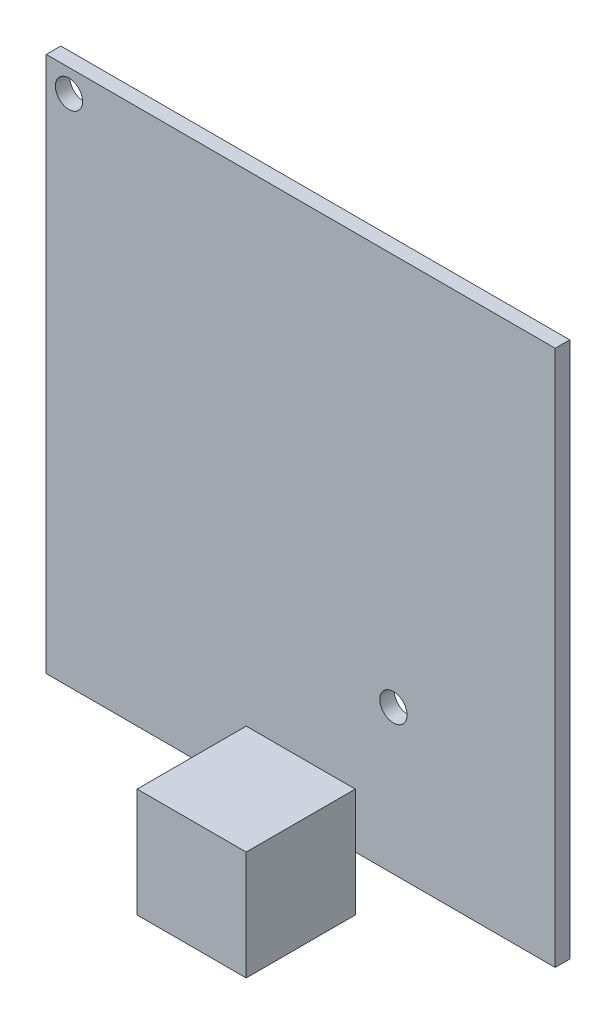
ISO-10303-21;
HEADER;
FILE_DESCRIPTION(('STEP AP214'),'2;1');
FILE_NAME('part.step','',(''),(''),'','','');
FILE_SCHEMA(('AUTOMOTIVE_DESIGN { 1 0 10303 214 1 1 1 1 }'));
ENDSEC;
DATA;
#1=APPLICATION_CONTEXT('core data for automotive mechanical design processes');
#2=APPLICATION_PROTOCOL_DEFINITION('international standard','automotive_design',2000,#1);
#3=PRODUCT_CONTEXT('',#1,'mechanical');
#4=PRODUCT('Part','Part','',(#3));
#5=PRODUCT_RELATED_PRODUCT_CATEGORY('part','',(#4));
#6=PRODUCT_DEFINITION_FORMATION('','',#4);
#7=PRODUCT_DEFINITION_CONTEXT('part definition',#1,'design');
#8=PRODUCT_DEFINITION('design','',#6,#7);
#9=PRODUCT_DEFINITION_SHAPE('','',#8);
#10=(LENGTH_UNIT() NAMED_UNIT(*) SI_UNIT(.MILLI.,.METRE.));
#11=(NAMED_UNIT(*) PLANE_ANGLE_UNIT() SI_UNIT($,.RADIAN.));
#12=(NAMED_UNIT(*) SI_UNIT($,.STERADIAN.) SOLID_ANGLE_UNIT());
#13=UNCERTAINTY_MEASURE_WITH_UNIT(LENGTH_MEASURE(1.E-05),#10,'distance_accuracy_value','');
#14=(GEOMETRIC_REPRESENTATION_CONTEXT(3) GLOBAL_UNCERTAINTY_ASSIGNED_CONTEXT((#13)) GLOBAL_UNIT_ASSIGNED_CONTEXT((#10,
#11,#12)) REPRESENTATION_CONTEXT('',''));
#15=CARTESIAN_POINT('',(0.,0.,0.));
#16=DIRECTION('',(0.,0.,1.));
#17=DIRECTION('',(1.,0.,0.));
#18=AXIS2_PLACEMENT_3D('',#15,#16,#17);
#19=CARTESIAN_POINT('',(28.,0.,13.6));
#20=DIRECTION('',(0.,0.,1.));
#21=DIRECTION('',(1.,0.,0.));
#22=AXIS2_PLACEMENT_3D('',#19,#20,#21);
#23=PLANE('',#22);
#24=DIRECTION('',(0.,1.,0.));
#25=VECTOR('',#24,1.);
#26=CARTESIAN_POINT('',(22.,-6.,13.6));
#27=LINE('',#26,#25);
#28=CARTESIAN_POINT('',(22.,-6.,13.6));
#29=VERTEX_POINT('',#28);
#30=CARTESIAN_POINT('',(22.,6.,13.6));
#31=VERTEX_POINT('',#30);
#32=EDGE_CURVE('E107',#29,#31,#27,.T.);
#33=ORIENTED_EDGE('',*,*,#32,.F.);
#34=DIRECTION('',(1.,0.,0.));
#35=VECTOR('',#34,1.);
#36=CARTESIAN_POINT('',(34.,-6.,13.6));
#37=LINE('',#36,#35);
#38=CARTESIAN_POINT('',(34.,-6.,13.6));
#39=VERTEX_POINT('',#38);
#40=EDGE_CURVE('E90',#39,#29,#37,.F.);
#41=ORIENTED_EDGE('',*,*,#40,.F.);
#42=DIRECTION('',(0.,1.,0.));
#43=VECTOR('',#42,1.);
#44=CARTESIAN_POINT('',(34.,6.,13.6));
#45=LINE('',#44,#43);
#46=CARTESIAN_POINT('',(34.,6.,13.6));
#47=VERTEX_POINT('',#46);
#48=EDGE_CURVE('E96',#47,#39,#45,.F.);
#49=ORIENTED_EDGE('',*,*,#48,.F.);
#50=DIRECTION('',(1.,0.,0.));
#51=VECTOR('',#50,1.);
#52=CARTESIAN_POINT('',(22.,6.,13.6));
#53=LINE('',#52,#51);
#54=EDGE_CURVE('E187',#31,#47,#53,.T.);
#55=ORIENTED_EDGE('',*,*,#54,.F.);
#56=EDGE_LOOP('',(#33,#41,#49,#55));
#57=FACE_BOUND('',#56,.T.);
#58=ADVANCED_FACE('F17',(#57),#23,.T.);
#59=CARTESIAN_POINT('',(34.,-6.,1.6));
#60=DIRECTION('',(0.,-1.,0.));
#61=DIRECTION('',(0.,0.,-1.));
#62=AXIS2_PLACEMENT_3D('',#59,#60,#61);
#63=PLANE('',#62);
#64=DIRECTION('',(1.,0.,0.));
#65=VECTOR('',#64,1.);
#66=CARTESIAN_POINT('',(28.,-6.,1.6));
#67=LINE('',#66,#65);
#68=CARTESIAN_POINT('',(22.,-6.,1.6));
#69=VERTEX_POINT('',#68);
#70=CARTESIAN_POINT('',(34.,-6.,1.6));
#71=VERTEX_POINT('',#70);
#72=EDGE_CURVE('E112',#69,#71,#67,.T.);
#73=ORIENTED_EDGE('',*,*,#72,.T.);
#74=DIRECTION('',(0.,0.,-1.));
#75=VECTOR('',#74,1.);
#76=CARTESIAN_POINT('',(34.,-6.,1.6));
#77=LINE('',#76,#75);
#78=EDGE_CURVE('E100',#39,#71,#77,.T.);
#79=ORIENTED_EDGE('',*,*,#78,.F.);
#80=ORIENTED_EDGE('',*,*,#40,.T.);
#81=DIRECTION('',(0.,0.,1.));
#82=VECTOR('',#81,1.);
#83=CARTESIAN_POINT('',(22.,-6.,1.6));
#84=LINE('',#83,#82);
#85=EDGE_CURVE('E114',#69,#29,#84,.T.);
#86=ORIENTED_EDGE('',*,*,#85,.F.);
#87=EDGE_LOOP('',(#73,#79,#80,#86));
#88=FACE_BOUND('',#87,.T.);
#89=ADVANCED_FACE('F110',(#88),#63,.T.);
#90=CARTESIAN_POINT('',(34.,6.,1.6));
#91=DIRECTION('',(1.,0.,0.));
#92=DIRECTION('',(0.,0.,-1.));
#93=AXIS2_PLACEMENT_3D('',#90,#91,#92);
#94=PLANE('',#93);
#95=DIRECTION('',(0.,1.,0.));
#96=VECTOR('',#95,1.);
#97=CARTESIAN_POINT('',(34.,29.5,1.6));
#98=LINE('',#97,#96);
#99=CARTESIAN_POINT('',(34.,6.,1.6));
#100=VERTEX_POINT('',#99);
#101=CARTESIAN_POINT('',(34.,0.,1.6));
#102=VERTEX_POINT('',#101);
#103=EDGE_CURVE('E175',#100,#102,#98,.F.);
#104=ORIENTED_EDGE('',*,*,#103,.F.);
#105=DIRECTION('',(0.,0.,1.));
#106=VECTOR('',#105,1.);
#107=CARTESIAN_POINT('',(34.,6.,1.6));
#108=LINE('',#107,#106);
#109=EDGE_CURVE('E102',#47,#100,#108,.F.);
#110=ORIENTED_EDGE('',*,*,#109,.F.);
#111=ORIENTED_EDGE('',*,*,#48,.T.);
#112=ORIENTED_EDGE('',*,*,#78,.T.);
#113=DIRECTION('',(0.,1.,0.));
#114=VECTOR('',#113,1.);
#115=CARTESIAN_POINT('',(34.,0.,1.6));
#116=LINE('',#115,#114);
#117=EDGE_CURVE('E177',#71,#102,#116,.T.);
#118=ORIENTED_EDGE('',*,*,#117,.T.);
#119=EDGE_LOOP('',(#104,#110,#111,#112,#118));
#120=FACE_BOUND('',#119,.T.);
#121=ADVANCED_FACE('F98',(#120),#94,.T.);
#122=CARTESIAN_POINT('',(22.,-6.,1.6));
#123=DIRECTION('',(-1.,0.,0.));
#124=DIRECTION('',(0.,0.,1.));
#125=AXIS2_PLACEMENT_3D('',#122,#123,#124);
#126=PLANE('',#125);
#127=DIRECTION('',(0.,1.,0.));
#128=VECTOR('',#127,1.);
#129=CARTESIAN_POINT('',(22.,0.,1.6));
#130=LINE('',#129,#128);
#131=CARTESIAN_POINT('',(22.,0.,1.6));
#132=VERTEX_POINT('',#131);
#133=EDGE_CURVE('E180',#132,#69,#130,.F.);
#134=ORIENTED_EDGE('',*,*,#133,.T.);
#135=ORIENTED_EDGE('',*,*,#85,.T.);
#136=ORIENTED_EDGE('',*,*,#32,.T.);
#137=DIRECTION('',(0.,0.,1.));
#138=VECTOR('',#137,1.);
#139=CARTESIAN_POINT('',(22.,6.,1.6));
#140=LINE('',#139,#138);
#141=CARTESIAN_POINT('',(22.,6.,1.6));
#142=VERTEX_POINT('',#141);
#143=EDGE_CURVE('E183',#142,#31,#140,.T.);
#144=ORIENTED_EDGE('',*,*,#143,.F.);
#145=DIRECTION('',(0.,1.,0.));
#146=VECTOR('',#145,1.);
#147=CARTESIAN_POINT('',(22.,29.5,1.6));
#148=LINE('',#147,#146);
#149=EDGE_CURVE('E173',#132,#142,#148,.T.);
#150=ORIENTED_EDGE('',*,*,#149,.F.);
#151=EDGE_LOOP('',(#134,#135,#136,#144,#150));
#152=FACE_BOUND('',#151,.T.);
#153=ADVANCED_FACE('F189',(#152),#126,.T.);
#154=CARTESIAN_POINT('',(22.,6.,1.6));
#155=DIRECTION('',(0.,1.,0.));
#156=DIRECTION('',(0.,0.,1.));
#157=AXIS2_PLACEMENT_3D('',#154,#155,#156);
#158=PLANE('',#157);
#159=DIRECTION('',(1.,0.,0.));
#160=VECTOR('',#159,1.);
#161=CARTESIAN_POINT('',(28.,6.,1.6));
#162=LINE('',#161,#160);
#163=EDGE_CURVE('E170',#142,#100,#162,.T.);
#164=ORIENTED_EDGE('',*,*,#163,.F.);
#165=ORIENTED_EDGE('',*,*,#143,.T.);
#166=ORIENTED_EDGE('',*,*,#54,.T.);
#167=ORIENTED_EDGE('',*,*,#109,.T.);
#168=EDGE_LOOP('',(#164,#165,#166,#167));
#169=FACE_BOUND('',#168,.T.);
#170=ADVANCED_FACE('F291',(#169),#158,.T.);
#171=CARTESIAN_POINT('',(28.,0.,1.6));
#172=DIRECTION('',(0.,0.,1.));
#173=DIRECTION('',(1.,0.,0.));
#174=AXIS2_PLACEMENT_3D('',#171,#172,#173);
#175=PLANE('',#174);
#176=ORIENTED_EDGE('',*,*,#117,.F.);
#177=ORIENTED_EDGE('',*,*,#72,.F.);
#178=ORIENTED_EDGE('',*,*,#133,.F.);
#179=DIRECTION('',(1.,0.,0.));
#180=VECTOR('',#179,1.);
#181=CARTESIAN_POINT('',(56.,0.,1.6));
#182=LINE('',#181,#180);
#183=EDGE_CURVE('E151',#102,#132,#182,.F.);
#184=ORIENTED_EDGE('',*,*,#183,.F.);
#185=EDGE_LOOP('',(#176,#177,#178,#184));
#186=FACE_BOUND('',#185,.T.);
#187=ADVANCED_FACE('F193',(#186),#175,.F.);
#188=CARTESIAN_POINT('',(28.,29.5,1.6));
#189=DIRECTION('',(0.,0.,1.));
#190=DIRECTION('',(1.,0.,0.));
#191=AXIS2_PLACEMENT_3D('',#188,#189,#190);
#192=PLANE('',#191);
#193=CARTESIAN_POINT('',(2.49999999999998,56.5,1.6));
#194=DIRECTION('',(0.,0.,1.));
#195=DIRECTION('',(1.,0.,0.));
#196=AXIS2_PLACEMENT_3D('',#193,#194,#195);
#197=CIRCLE('',#196,1.5);
#198=CARTESIAN_POINT('',(3.99999999999998,56.5,1.6));
#199=VERTEX_POINT('',#198);
#200=EDGE_CURVE('E121',#199,#199,#197,.F.);
#201=ORIENTED_EDGE('',*,*,#200,.T.);
#202=EDGE_LOOP('',(#201));
#203=FACE_BOUND('',#202,.T.);
#204=CARTESIAN_POINT('',(38.2,15.9,1.6));
#205=DIRECTION('',(0.,0.,1.));
#206=DIRECTION('',(1.,0.,0.));
#207=AXIS2_PLACEMENT_3D('',#204,#205,#206);
#208=CIRCLE('',#207,1.5);
#209=CARTESIAN_POINT('',(39.7,15.9,1.6));
#210=VERTEX_POINT('',#209);
#211=EDGE_CURVE('E20',#210,#210,#208,.F.);
#212=ORIENTED_EDGE('',*,*,#211,.T.);
#213=EDGE_LOOP('',(#212));
#214=FACE_BOUND('',#213,.T.);
#215=ORIENTED_EDGE('',*,*,#149,.T.);
#216=ORIENTED_EDGE('',*,*,#163,.T.);
#217=ORIENTED_EDGE('',*,*,#103,.T.);
#218=DIRECTION('',(1.,0.,0.));
#219=VECTOR('',#218,1.);
#220=CARTESIAN_POINT('',(56.,0.,1.6));
#221=LINE('',#220,#219);
#222=CARTESIAN_POINT('',(56.,0.,1.6));
#223=VERTEX_POINT('',#222);
#224=EDGE_CURVE('E154',#223,#102,#221,.F.);
#225=ORIENTED_EDGE('',*,*,#224,.F.);
#226=DIRECTION('',(0.,1.,0.));
#227=VECTOR('',#226,1.);
#228=CARTESIAN_POINT('',(56.,59.,1.6));
#229=LINE('',#228,#227);
#230=CARTESIAN_POINT('',(56.,59.,1.6));
#231=VERTEX_POINT('',#230);
#232=EDGE_CURVE('E167',#231,#223,#229,.F.);
#233=ORIENTED_EDGE('',*,*,#232,.F.);
#234=DIRECTION('',(1.,0.,0.));
#235=VECTOR('',#234,1.);
#236=CARTESIAN_POINT('',(0.,59.,1.6));
#237=LINE('',#236,#235);
#238=CARTESIAN_POINT('',(0.,59.,1.6));
#239=VERTEX_POINT('',#238);
#240=EDGE_CURVE('E164',#239,#231,#237,.T.);
#241=ORIENTED_EDGE('',*,*,#240,.F.);
#242=DIRECTION('',(0.,1.,0.));
#243=VECTOR('',#242,1.);
#244=CARTESIAN_POINT('',(0.,0.,1.6));
#245=LINE('',#244,#243);
#246=CARTESIAN_POINT('',(0.,0.,1.6));
#247=VERTEX_POINT('',#246);
#248=EDGE_CURVE('E159',#247,#239,#245,.T.);
#249=ORIENTED_EDGE('',*,*,#248,.F.);
#250=DIRECTION('',(1.,0.,0.));
#251=VECTOR('',#250,1.);
#252=CARTESIAN_POINT('',(56.,0.,1.6));
#253=LINE('',#252,#251);
#254=EDGE_CURVE('E146',#132,#247,#253,.F.);
#255=ORIENTED_EDGE('',*,*,#254,.F.);
#256=EDGE_LOOP('',(#215,#216,#217,#225,#233,#241,#249,#255));
#257=FACE_BOUND('',#256,.T.);
#258=ADVANCED_FACE('F196',(#203,#214,#257),#192,.T.);
#259=CARTESIAN_POINT('',(56.,59.,0.));
#260=DIRECTION('',(1.,0.,0.));
#261=DIRECTION('',(0.,0.,-1.));
#262=AXIS2_PLACEMENT_3D('',#259,#260,#261);
#263=PLANE('',#262);
#264=DIRECTION('',(0.,1.,0.));
#265=VECTOR('',#264,1.);
#266=CARTESIAN_POINT('',(56.,29.5,0.));
#267=LINE('',#266,#265);
#268=CARTESIAN_POINT('',(56.,0.,0.));
#269=VERTEX_POINT('',#268);
#270=CARTESIAN_POINT('',(56.,59.,0.));
#271=VERTEX_POINT('',#270);
#272=EDGE_CURVE('E124',#269,#271,#267,.T.);
#273=ORIENTED_EDGE('',*,*,#272,.T.);
#274=DIRECTION('',(0.,0.,1.));
#275=VECTOR('',#274,1.);
#276=CARTESIAN_POINT('',(56.,59.,0.));
#277=LINE('',#276,#275);
#278=EDGE_CURVE('E162',#231,#271,#277,.F.);
#279=ORIENTED_EDGE('',*,*,#278,.F.);
#280=ORIENTED_EDGE('',*,*,#232,.T.);
#281=DIRECTION('',(0.,0.,-1.));
#282=VECTOR('',#281,1.);
#283=CARTESIAN_POINT('',(56.,0.,0.));
#284=LINE('',#283,#282);
#285=EDGE_CURVE('E135',#269,#223,#284,.F.);
#286=ORIENTED_EDGE('',*,*,#285,.F.);
#287=EDGE_LOOP('',(#273,#279,#280,#286));
#288=FACE_BOUND('',#287,.T.);
#289=ADVANCED_FACE('F220',(#288),#263,.T.);
#290=CARTESIAN_POINT('',(0.,59.,0.));
#291=DIRECTION('',(0.,1.,0.));
#292=DIRECTION('',(0.,0.,1.));
#293=AXIS2_PLACEMENT_3D('',#290,#291,#292);
#294=PLANE('',#293);
#295=DIRECTION('',(1.,0.,0.));
#296=VECTOR('',#295,1.);
#297=CARTESIAN_POINT('',(28.,59.,0.));
#298=LINE('',#297,#296);
#299=CARTESIAN_POINT('',(0.,59.,0.));
#300=VERTEX_POINT('',#299);
#301=EDGE_CURVE('E131',#271,#300,#298,.F.);
#302=ORIENTED_EDGE('',*,*,#301,.T.);
#303=DIRECTION('',(0.,0.,1.));
#304=VECTOR('',#303,1.);
#305=CARTESIAN_POINT('',(0.,59.,0.));
#306=LINE('',#305,#304);
#307=EDGE_CURVE('E156',#239,#300,#306,.F.);
#308=ORIENTED_EDGE('',*,*,#307,.F.);
#309=ORIENTED_EDGE('',*,*,#240,.T.);
#310=ORIENTED_EDGE('',*,*,#278,.T.);
#311=EDGE_LOOP('',(#302,#308,#309,#310));
#312=FACE_BOUND('',#311,.T.);
#313=ADVANCED_FACE('F216',(#312),#294,.T.);
#314=CARTESIAN_POINT('',(0.,0.,0.));
#315=DIRECTION('',(-1.,0.,0.));
#316=DIRECTION('',(0.,0.,1.));
#317=AXIS2_PLACEMENT_3D('',#314,#315,#316);
#318=PLANE('',#317);
#319=DIRECTION('',(0.,1.,0.));
#320=VECTOR('',#319,1.);
#321=CARTESIAN_POINT('',(0.,29.5,0.));
#322=LINE('',#321,#320);
#323=CARTESIAN_POINT('',(0.,0.,0.));
#324=VERTEX_POINT('',#323);
#325=EDGE_CURVE('E208',#300,#324,#322,.F.);
#326=ORIENTED_EDGE('',*,*,#325,.T.);
#327=DIRECTION('',(0.,0.,-1.));
#328=VECTOR('',#327,1.);
#329=CARTESIAN_POINT('',(0.,0.,0.));
#330=LINE('',#329,#328);
#331=EDGE_CURVE('E36',#247,#324,#330,.T.);
#332=ORIENTED_EDGE('',*,*,#331,.F.);
#333=ORIENTED_EDGE('',*,*,#248,.T.);
#334=ORIENTED_EDGE('',*,*,#307,.T.);
#335=EDGE_LOOP('',(#326,#332,#333,#334));
#336=FACE_BOUND('',#335,.T.);
#337=ADVANCED_FACE('F206',(#336),#318,.T.);
#338=CARTESIAN_POINT('',(56.,0.,0.));
#339=DIRECTION('',(0.,-1.,0.));
#340=DIRECTION('',(0.,0.,-1.));
#341=AXIS2_PLACEMENT_3D('',#338,#339,#340);
#342=PLANE('',#341);
#343=DIRECTION('',(1.,0.,0.));
#344=VECTOR('',#343,1.);
#345=CARTESIAN_POINT('',(28.,0.,0.));
#346=LINE('',#345,#344);
#347=EDGE_CURVE('E120',#324,#269,#346,.T.);
#348=ORIENTED_EDGE('',*,*,#347,.T.);
#349=ORIENTED_EDGE('',*,*,#285,.T.);
#350=ORIENTED_EDGE('',*,*,#224,.T.);
#351=ORIENTED_EDGE('',*,*,#183,.T.);
#352=ORIENTED_EDGE('',*,*,#254,.T.);
#353=ORIENTED_EDGE('',*,*,#331,.T.);
#354=EDGE_LOOP('',(#348,#349,#350,#351,#352,#353));
#355=FACE_BOUND('',#354,.T.);
#356=ADVANCED_FACE('F199',(#355),#342,.T.);
#357=CARTESIAN_POINT('',(38.2,15.9,-85.2674852864983));
#358=DIRECTION('',(0.,0.,1.));
#359=DIRECTION('',(1.,0.,0.));
#360=AXIS2_PLACEMENT_3D('',#357,#358,#359);
#361=CYLINDRICAL_SURFACE('',#360,1.5);
#362=ORIENTED_EDGE('',*,*,#211,.F.);
#363=EDGE_LOOP('',(#362));
#364=FACE_BOUND('',#363,.T.);
#365=CARTESIAN_POINT('',(38.2,15.9,0.));
#366=DIRECTION('',(0.,0.,1.));
#367=DIRECTION('',(1.,0.,0.));
#368=AXIS2_PLACEMENT_3D('',#365,#366,#367);
#369=CIRCLE('',#368,1.5);
#370=CARTESIAN_POINT('',(39.7,15.9,0.));
#371=VERTEX_POINT('',#370);
#372=EDGE_CURVE('E27',#371,#371,#369,.F.);
#373=ORIENTED_EDGE('',*,*,#372,.T.);
#374=EDGE_LOOP('',(#373));
#375=FACE_BOUND('',#374,.T.);
#376=ADVANCED_FACE('F237',(#364,#375),#361,.F.);
#377=CARTESIAN_POINT('',(2.49999999999998,56.5,-85.2674852864983));
#378=DIRECTION('',(0.,0.,1.));
#379=DIRECTION('',(1.,0.,0.));
#380=AXIS2_PLACEMENT_3D('',#377,#378,#379);
#381=CYLINDRICAL_SURFACE('',#380,1.5);
#382=ORIENTED_EDGE('',*,*,#200,.F.);
#383=EDGE_LOOP('',(#382));
#384=FACE_BOUND('',#383,.T.);
#385=CARTESIAN_POINT('',(2.49999999999998,56.5,0.));
#386=DIRECTION('',(0.,0.,1.));
#387=DIRECTION('',(1.,0.,0.));
#388=AXIS2_PLACEMENT_3D('',#385,#386,#387);
#389=CIRCLE('',#388,1.5);
#390=CARTESIAN_POINT('',(3.99999999999998,56.5,0.));
#391=VERTEX_POINT('',#390);
#392=EDGE_CURVE('E11',#391,#391,#389,.F.);
#393=ORIENTED_EDGE('',*,*,#392,.T.);
#394=EDGE_LOOP('',(#393));
#395=FACE_BOUND('',#394,.T.);
#396=ADVANCED_FACE('F231',(#384,#395),#381,.F.);
#397=CARTESIAN_POINT('',(28.,29.5,0.));
#398=DIRECTION('',(0.,0.,1.));
#399=DIRECTION('',(1.,0.,0.));
#400=AXIS2_PLACEMENT_3D('',#397,#398,#399);
#401=PLANE('',#400);
#402=ORIENTED_EDGE('',*,*,#392,.F.);
#403=EDGE_LOOP('',(#402));
#404=FACE_BOUND('',#403,.T.);
#405=ORIENTED_EDGE('',*,*,#372,.F.);
#406=EDGE_LOOP('',(#405));
#407=FACE_BOUND('',#406,.T.);
#408=ORIENTED_EDGE('',*,*,#325,.F.);
#409=ORIENTED_EDGE('',*,*,#301,.F.);
#410=ORIENTED_EDGE('',*,*,#272,.F.);
#411=ORIENTED_EDGE('',*,*,#347,.F.);
#412=EDGE_LOOP('',(#408,#409,#410,#411));
#413=FACE_BOUND('',#412,.T.);
#414=ADVANCED_FACE('F218',(#404,#407,#413),#401,.F.);
#415=CLOSED_SHELL('',(#58,#89,#121,#153,#170,#187,#258,#289,#313,#337,#356,#376,#396,#414));
#416=MANIFOLD_SOLID_BREP('B1',#415);
#417=ADVANCED_BREP_SHAPE_REPRESENTATION('',(#18,#416),#14);
#418=SHAPE_DEFINITION_REPRESENTATION(#9,#417);
ENDSEC;
END-ISO-10303-21;
